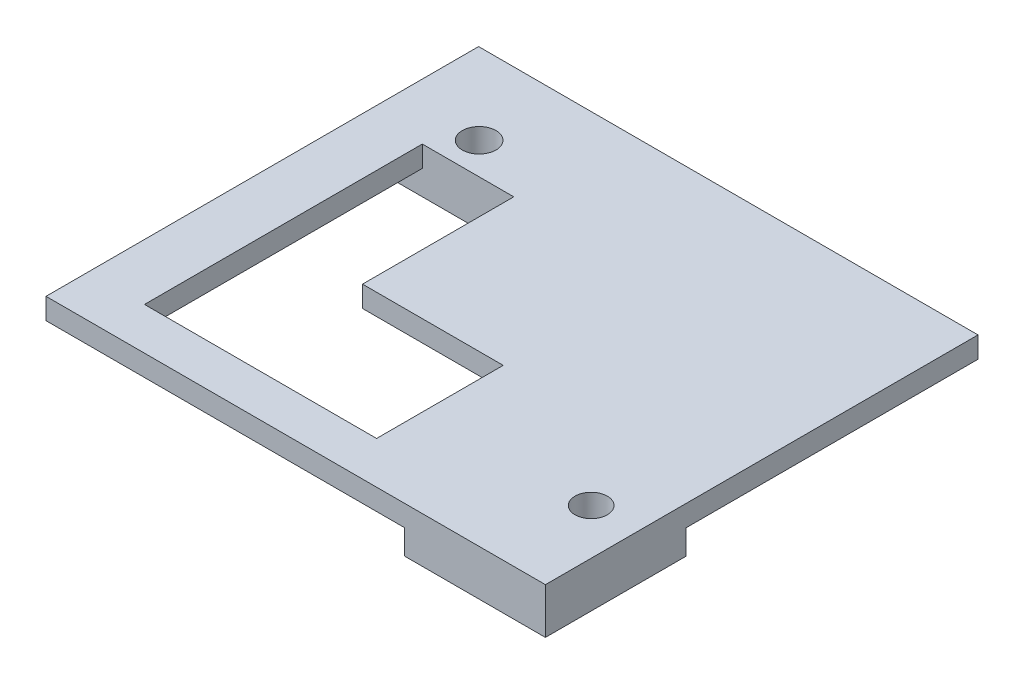
ISO-10303-21;
HEADER;
FILE_DESCRIPTION(('STEP AP214'),'2;1');
FILE_NAME('part.step','',(''),(''),'','','');
FILE_SCHEMA(('AUTOMOTIVE_DESIGN { 1 0 10303 214 1 1 1 1 }'));
ENDSEC;
DATA;
#1=APPLICATION_CONTEXT('core data for automotive mechanical design processes');
#2=APPLICATION_PROTOCOL_DEFINITION('international standard','automotive_design',2000,#1);
#3=PRODUCT_CONTEXT('',#1,'mechanical');
#4=PRODUCT('Part','Part','',(#3));
#5=PRODUCT_RELATED_PRODUCT_CATEGORY('part','',(#4));
#6=PRODUCT_DEFINITION_FORMATION('','',#4);
#7=PRODUCT_DEFINITION_CONTEXT('part definition',#1,'design');
#8=PRODUCT_DEFINITION('design','',#6,#7);
#9=PRODUCT_DEFINITION_SHAPE('','',#8);
#10=(LENGTH_UNIT() NAMED_UNIT(*) SI_UNIT(.MILLI.,.METRE.));
#11=(NAMED_UNIT(*) PLANE_ANGLE_UNIT() SI_UNIT($,.RADIAN.));
#12=(NAMED_UNIT(*) SI_UNIT($,.STERADIAN.) SOLID_ANGLE_UNIT());
#13=UNCERTAINTY_MEASURE_WITH_UNIT(LENGTH_MEASURE(1.E-05),#10,'distance_accuracy_value','');
#14=(GEOMETRIC_REPRESENTATION_CONTEXT(3) GLOBAL_UNCERTAINTY_ASSIGNED_CONTEXT((#13)) GLOBAL_UNIT_ASSIGNED_CONTEXT((#10,
#11,#12)) REPRESENTATION_CONTEXT('',''));
#15=CARTESIAN_POINT('',(0.,0.,0.));
#16=DIRECTION('',(0.,0.,1.));
#17=DIRECTION('',(1.,0.,0.));
#18=AXIS2_PLACEMENT_3D('',#15,#16,#17);
#19=CARTESIAN_POINT('',(0.,1.5,0.));
#20=DIRECTION('',(0.,0.,-1.));
#21=DIRECTION('',(-1.,0.,0.));
#22=AXIS2_PLACEMENT_3D('',#19,#20,#21);
#23=PLANE('',#22);
#24=DIRECTION('',(1.,0.,0.));
#25=VECTOR('',#24,1.);
#26=CARTESIAN_POINT('',(0.,0.,0.));
#27=LINE('',#26,#25);
#28=CARTESIAN_POINT('',(10.,0.,0.));
#29=VERTEX_POINT('',#28);
#30=CARTESIAN_POINT('',(35.5,0.,0.));
#31=VERTEX_POINT('',#30);
#32=EDGE_CURVE('E232',#29,#31,#27,.T.);
#33=ORIENTED_EDGE('',*,*,#32,.T.);
#34=DIRECTION('',(0.,1.,0.));
#35=VECTOR('',#34,1.);
#36=CARTESIAN_POINT('',(35.5,-1.75,0.));
#37=LINE('',#36,#35);
#38=CARTESIAN_POINT('',(35.5,-1.75,0.));
#39=VERTEX_POINT('',#38);
#40=EDGE_CURVE('E187',#39,#31,#37,.T.);
#41=ORIENTED_EDGE('',*,*,#40,.F.);
#42=DIRECTION('',(1.,0.,0.));
#43=VECTOR('',#42,1.);
#44=CARTESIAN_POINT('',(45.5,-1.75,0.));
#45=LINE('',#44,#43);
#46=CARTESIAN_POINT('',(45.5,-1.75,0.));
#47=VERTEX_POINT('',#46);
#48=EDGE_CURVE('E159',#39,#47,#45,.T.);
#49=ORIENTED_EDGE('',*,*,#48,.T.);
#50=DIRECTION('',(0.,-1.,0.));
#51=VECTOR('',#50,1.);
#52=CARTESIAN_POINT('',(45.5,1.5,0.));
#53=LINE('',#52,#51);
#54=CARTESIAN_POINT('',(45.5,1.5,0.));
#55=VERTEX_POINT('',#54);
#56=EDGE_CURVE('E175',#55,#47,#53,.T.);
#57=ORIENTED_EDGE('',*,*,#56,.F.);
#58=DIRECTION('',(1.,0.,0.));
#59=VECTOR('',#58,1.);
#60=CARTESIAN_POINT('',(0.,1.5,0.));
#61=LINE('',#60,#59);
#62=CARTESIAN_POINT('',(10.,1.5,0.));
#63=VERTEX_POINT('',#62);
#64=EDGE_CURVE('E280',#63,#55,#61,.T.);
#65=ORIENTED_EDGE('',*,*,#64,.F.);
#66=DIRECTION('',(0.,1.,0.));
#67=VECTOR('',#66,1.);
#68=CARTESIAN_POINT('',(10.,0.,0.));
#69=LINE('',#68,#67);
#70=EDGE_CURVE('E230',#29,#63,#69,.T.);
#71=ORIENTED_EDGE('',*,*,#70,.F.);
#72=EDGE_LOOP('',(#33,#41,#49,#57,#65,#71));
#73=FACE_BOUND('',#72,.T.);
#74=ADVANCED_FACE('F36',(#73),#23,.F.);
#75=CARTESIAN_POINT('',(0.,1.5,-30.75));
#76=DIRECTION('',(0.,0.,1.));
#77=DIRECTION('',(1.,0.,0.));
#78=AXIS2_PLACEMENT_3D('',#75,#76,#77);
#79=PLANE('',#78);
#80=DIRECTION('',(-1.,0.,0.));
#81=VECTOR('',#80,1.);
#82=CARTESIAN_POINT('',(0.,0.,-30.75));
#83=LINE('',#82,#81);
#84=CARTESIAN_POINT('',(45.5,0.,-30.75));
#85=VERTEX_POINT('',#84);
#86=CARTESIAN_POINT('',(20.,0.,-30.75));
#87=VERTEX_POINT('',#86);
#88=EDGE_CURVE('E283',#85,#87,#83,.T.);
#89=ORIENTED_EDGE('',*,*,#88,.T.);
#90=DIRECTION('',(0.,1.,0.));
#91=VECTOR('',#90,1.);
#92=CARTESIAN_POINT('',(20.,-1.75,-30.75));
#93=LINE('',#92,#91);
#94=CARTESIAN_POINT('',(20.,-1.75,-30.75));
#95=VERTEX_POINT('',#94);
#96=EDGE_CURVE('E209',#95,#87,#93,.T.);
#97=ORIENTED_EDGE('',*,*,#96,.F.);
#98=DIRECTION('',(-1.,0.,0.));
#99=VECTOR('',#98,1.);
#100=CARTESIAN_POINT('',(12.,-1.75,-30.75));
#101=LINE('',#100,#99);
#102=CARTESIAN_POINT('',(12.,-1.75,-30.75));
#103=VERTEX_POINT('',#102);
#104=EDGE_CURVE('E201',#95,#103,#101,.T.);
#105=ORIENTED_EDGE('',*,*,#104,.T.);
#106=DIRECTION('',(0.,1.,0.));
#107=VECTOR('',#106,1.);
#108=CARTESIAN_POINT('',(12.,-1.75,-30.75));
#109=LINE('',#108,#107);
#110=CARTESIAN_POINT('',(12.,0.,-30.75));
#111=VERTEX_POINT('',#110);
#112=EDGE_CURVE('E205',#103,#111,#109,.T.);
#113=ORIENTED_EDGE('',*,*,#112,.T.);
#114=CARTESIAN_POINT('',(10.,0.,-30.75));
#115=VERTEX_POINT('',#114);
#116=EDGE_CURVE('E291',#111,#115,#83,.T.);
#117=ORIENTED_EDGE('',*,*,#116,.T.);
#118=DIRECTION('',(0.,1.,0.));
#119=VECTOR('',#118,1.);
#120=CARTESIAN_POINT('',(10.,0.,-30.75));
#121=LINE('',#120,#119);
#122=CARTESIAN_POINT('',(10.,1.5,-30.75));
#123=VERTEX_POINT('',#122);
#124=EDGE_CURVE('E225',#115,#123,#121,.T.);
#125=ORIENTED_EDGE('',*,*,#124,.T.);
#126=DIRECTION('',(-1.,0.,0.));
#127=VECTOR('',#126,1.);
#128=CARTESIAN_POINT('',(0.,1.5,-30.75));
#129=LINE('',#128,#127);
#130=CARTESIAN_POINT('',(45.5,1.5,-30.75));
#131=VERTEX_POINT('',#130);
#132=EDGE_CURVE('E285',#131,#123,#129,.T.);
#133=ORIENTED_EDGE('',*,*,#132,.F.);
#134=DIRECTION('',(0.,-1.,0.));
#135=VECTOR('',#134,1.);
#136=CARTESIAN_POINT('',(45.5,1.5,-30.75));
#137=LINE('',#136,#135);
#138=EDGE_CURVE('E287',#131,#85,#137,.T.);
#139=ORIENTED_EDGE('',*,*,#138,.T.);
#140=EDGE_LOOP('',(#89,#97,#105,#113,#117,#125,#133,#139));
#141=FACE_BOUND('',#140,.T.);
#142=ADVANCED_FACE('F301',(#141),#79,.F.);
#143=CARTESIAN_POINT('',(0.,1.5,0.));
#144=DIRECTION('',(0.,-1.,0.));
#145=DIRECTION('',(0.,0.,-1.));
#146=AXIS2_PLACEMENT_3D('',#143,#144,#145);
#147=PLANE('',#146);
#148=CARTESIAN_POINT('',(42.25,1.5,-6.5));
#149=DIRECTION('',(0.,-1.,0.));
#150=DIRECTION('',(0.,0.,-1.));
#151=AXIS2_PLACEMENT_3D('',#148,#149,#150);
#152=CIRCLE('',#151,1.15);
#153=CARTESIAN_POINT('',(42.25,1.5,-7.65));
#154=VERTEX_POINT('',#153);
#155=EDGE_CURVE('E176',#154,#154,#152,.T.);
#156=ORIENTED_EDGE('',*,*,#155,.T.);
#157=EDGE_LOOP('',(#156));
#158=FACE_BOUND('',#157,.T.);
#159=CARTESIAN_POINT('',(15.79,1.5,-25.));
#160=DIRECTION('',(0.,-1.,0.));
#161=DIRECTION('',(0.,0.,-1.));
#162=AXIS2_PLACEMENT_3D('',#159,#160,#161);
#163=CIRCLE('',#162,1.2);
#164=CARTESIAN_POINT('',(15.79,1.5,-26.2));
#165=VERTEX_POINT('',#164);
#166=EDGE_CURVE('E529',#165,#165,#163,.T.);
#167=ORIENTED_EDGE('',*,*,#166,.T.);
#168=EDGE_LOOP('',(#167));
#169=FACE_BOUND('',#168,.T.);
#170=ORIENTED_EDGE('',*,*,#64,.T.);
#171=DIRECTION('',(0.,0.,-1.));
#172=VECTOR('',#171,1.);
#173=CARTESIAN_POINT('',(45.5,1.5,0.));
#174=LINE('',#173,#172);
#175=EDGE_CURVE('E282',#55,#131,#174,.T.);
#176=ORIENTED_EDGE('',*,*,#175,.T.);
#177=ORIENTED_EDGE('',*,*,#132,.T.);
#178=DIRECTION('',(0.,0.,1.));
#179=VECTOR('',#178,1.);
#180=CARTESIAN_POINT('',(10.,1.5,0.));
#181=LINE('',#180,#179);
#182=EDGE_CURVE('E226',#123,#63,#181,.T.);
#183=ORIENTED_EDGE('',*,*,#182,.T.);
#184=EDGE_LOOP('',(#170,#176,#177,#183));
#185=FACE_BOUND('',#184,.T.);
#186=DIRECTION('',(0.,0.,1.));
#187=VECTOR('',#186,1.);
#188=CARTESIAN_POINT('',(14.,1.5,0.));
#189=LINE('',#188,#187);
#190=CARTESIAN_POINT('',(14.,1.5,-22.75));
#191=VERTEX_POINT('',#190);
#192=CARTESIAN_POINT('',(14.,1.5,-3.));
#193=VERTEX_POINT('',#192);
#194=EDGE_CURVE('E222',#191,#193,#189,.T.);
#195=ORIENTED_EDGE('',*,*,#194,.F.);
#196=DIRECTION('',(-1.,0.,0.));
#197=VECTOR('',#196,1.);
#198=CARTESIAN_POINT('',(0.,1.5,-22.75));
#199=LINE('',#198,#197);
#200=CARTESIAN_POINT('',(20.5,1.5,-22.75));
#201=VERTEX_POINT('',#200);
#202=EDGE_CURVE('E239',#201,#191,#199,.T.);
#203=ORIENTED_EDGE('',*,*,#202,.F.);
#204=DIRECTION('',(0.,0.,-1.));
#205=VECTOR('',#204,1.);
#206=CARTESIAN_POINT('',(20.5,1.5,0.));
#207=LINE('',#206,#205);
#208=CARTESIAN_POINT('',(20.5,1.5,-12.));
#209=VERTEX_POINT('',#208);
#210=EDGE_CURVE('E264',#209,#201,#207,.T.);
#211=ORIENTED_EDGE('',*,*,#210,.F.);
#212=DIRECTION('',(-1.,0.,0.));
#213=VECTOR('',#212,1.);
#214=CARTESIAN_POINT('',(0.,1.5,-12.));
#215=LINE('',#214,#213);
#216=CARTESIAN_POINT('',(30.5,1.5,-12.));
#217=VERTEX_POINT('',#216);
#218=EDGE_CURVE('E261',#217,#209,#215,.T.);
#219=ORIENTED_EDGE('',*,*,#218,.F.);
#220=DIRECTION('',(0.,0.,-1.));
#221=VECTOR('',#220,1.);
#222=CARTESIAN_POINT('',(30.5,1.5,0.));
#223=LINE('',#222,#221);
#224=CARTESIAN_POINT('',(30.5,1.5,-3.));
#225=VERTEX_POINT('',#224);
#226=EDGE_CURVE('E258',#225,#217,#223,.T.);
#227=ORIENTED_EDGE('',*,*,#226,.F.);
#228=DIRECTION('',(1.,0.,0.));
#229=VECTOR('',#228,1.);
#230=CARTESIAN_POINT('',(0.,1.5,-3.));
#231=LINE('',#230,#229);
#232=EDGE_CURVE('E255',#193,#225,#231,.T.);
#233=ORIENTED_EDGE('',*,*,#232,.F.);
#234=EDGE_LOOP('',(#195,#203,#211,#219,#227,#233));
#235=FACE_BOUND('',#234,.T.);
#236=ADVANCED_FACE('F353',(#158,#169,#185,#235),#147,.F.);
#237=CARTESIAN_POINT('',(0.,0.,0.));
#238=DIRECTION('',(0.,-1.,0.));
#239=DIRECTION('',(0.,0.,-1.));
#240=AXIS2_PLACEMENT_3D('',#237,#238,#239);
#241=PLANE('',#240);
#242=DIRECTION('',(0.,0.,-1.));
#243=VECTOR('',#242,1.);
#244=CARTESIAN_POINT('',(35.5,0.,0.));
#245=LINE('',#244,#243);
#246=CARTESIAN_POINT('',(35.5,0.,-10.));
#247=VERTEX_POINT('',#246);
#248=EDGE_CURVE('E11',#31,#247,#245,.T.);
#249=ORIENTED_EDGE('',*,*,#248,.F.);
#250=ORIENTED_EDGE('',*,*,#32,.F.);
#251=DIRECTION('',(0.,0.,1.));
#252=VECTOR('',#251,1.);
#253=CARTESIAN_POINT('',(10.,0.,0.));
#254=LINE('',#253,#252);
#255=EDGE_CURVE('E223',#115,#29,#254,.T.);
#256=ORIENTED_EDGE('',*,*,#255,.F.);
#257=ORIENTED_EDGE('',*,*,#116,.F.);
#258=DIRECTION('',(0.,0.,-1.));
#259=VECTOR('',#258,1.);
#260=CARTESIAN_POINT('',(12.,0.,0.));
#261=LINE('',#260,#259);
#262=CARTESIAN_POINT('',(12.,0.,-22.75));
#263=VERTEX_POINT('',#262);
#264=EDGE_CURVE('E43',#263,#111,#261,.T.);
#265=ORIENTED_EDGE('',*,*,#264,.F.);
#266=DIRECTION('',(-1.,0.,0.));
#267=VECTOR('',#266,1.);
#268=CARTESIAN_POINT('',(0.,0.,-22.75));
#269=LINE('',#268,#267);
#270=CARTESIAN_POINT('',(14.,0.,-22.75));
#271=VERTEX_POINT('',#270);
#272=EDGE_CURVE('E219',#271,#263,#269,.T.);
#273=ORIENTED_EDGE('',*,*,#272,.F.);
#274=DIRECTION('',(0.,0.,1.));
#275=VECTOR('',#274,1.);
#276=CARTESIAN_POINT('',(14.,0.,0.));
#277=LINE('',#276,#275);
#278=CARTESIAN_POINT('',(14.,0.,-3.));
#279=VERTEX_POINT('',#278);
#280=EDGE_CURVE('E235',#271,#279,#277,.T.);
#281=ORIENTED_EDGE('',*,*,#280,.T.);
#282=DIRECTION('',(1.,0.,0.));
#283=VECTOR('',#282,1.);
#284=CARTESIAN_POINT('',(0.,0.,-3.));
#285=LINE('',#284,#283);
#286=CARTESIAN_POINT('',(30.5,0.,-3.));
#287=VERTEX_POINT('',#286);
#288=EDGE_CURVE('E238',#279,#287,#285,.T.);
#289=ORIENTED_EDGE('',*,*,#288,.T.);
#290=DIRECTION('',(0.,0.,-1.));
#291=VECTOR('',#290,1.);
#292=CARTESIAN_POINT('',(30.5,0.,0.));
#293=LINE('',#292,#291);
#294=CARTESIAN_POINT('',(30.5,0.,-12.));
#295=VERTEX_POINT('',#294);
#296=EDGE_CURVE('E242',#287,#295,#293,.T.);
#297=ORIENTED_EDGE('',*,*,#296,.T.);
#298=DIRECTION('',(-1.,0.,0.));
#299=VECTOR('',#298,1.);
#300=CARTESIAN_POINT('',(0.,0.,-12.));
#301=LINE('',#300,#299);
#302=CARTESIAN_POINT('',(20.5,0.,-12.));
#303=VERTEX_POINT('',#302);
#304=EDGE_CURVE('E245',#295,#303,#301,.T.);
#305=ORIENTED_EDGE('',*,*,#304,.T.);
#306=DIRECTION('',(0.,0.,-1.));
#307=VECTOR('',#306,1.);
#308=CARTESIAN_POINT('',(20.5,0.,0.));
#309=LINE('',#308,#307);
#310=CARTESIAN_POINT('',(20.5,0.,-22.75));
#311=VERTEX_POINT('',#310);
#312=EDGE_CURVE('E248',#303,#311,#309,.T.);
#313=ORIENTED_EDGE('',*,*,#312,.T.);
#314=DIRECTION('',(-1.,0.,0.));
#315=VECTOR('',#314,1.);
#316=CARTESIAN_POINT('',(0.,0.,-22.75));
#317=LINE('',#316,#315);
#318=CARTESIAN_POINT('',(20.,0.,-22.75));
#319=VERTEX_POINT('',#318);
#320=EDGE_CURVE('E251',#311,#319,#317,.T.);
#321=ORIENTED_EDGE('',*,*,#320,.T.);
#322=DIRECTION('',(0.,0.,1.));
#323=VECTOR('',#322,1.);
#324=CARTESIAN_POINT('',(20.,0.,0.));
#325=LINE('',#324,#323);
#326=EDGE_CURVE('E208',#87,#319,#325,.T.);
#327=ORIENTED_EDGE('',*,*,#326,.F.);
#328=ORIENTED_EDGE('',*,*,#88,.F.);
#329=DIRECTION('',(0.,0.,-1.));
#330=VECTOR('',#329,1.);
#331=CARTESIAN_POINT('',(45.5,0.,0.));
#332=LINE('',#331,#330);
#333=CARTESIAN_POINT('',(45.5,0.,-10.));
#334=VERTEX_POINT('',#333);
#335=EDGE_CURVE('E289',#334,#85,#332,.T.);
#336=ORIENTED_EDGE('',*,*,#335,.F.);
#337=DIRECTION('',(1.,0.,0.));
#338=VECTOR('',#337,1.);
#339=CARTESIAN_POINT('',(0.,0.,-9.99999999999999));
#340=LINE('',#339,#338);
#341=EDGE_CURVE('E50',#247,#334,#340,.T.);
#342=ORIENTED_EDGE('',*,*,#341,.F.);
#343=EDGE_LOOP('',(#249,#250,#256,#257,#265,#273,#281,#289,#297,#305,#313,#321,#327,#328,#336,#342));
#344=FACE_BOUND('',#343,.T.);
#345=ADVANCED_FACE('F313',(#344),#241,.T.);
#346=CARTESIAN_POINT('',(45.5,1.5,0.));
#347=DIRECTION('',(-1.,0.,0.));
#348=DIRECTION('',(0.,0.,1.));
#349=AXIS2_PLACEMENT_3D('',#346,#347,#348);
#350=PLANE('',#349);
#351=ORIENTED_EDGE('',*,*,#138,.F.);
#352=ORIENTED_EDGE('',*,*,#175,.F.);
#353=ORIENTED_EDGE('',*,*,#56,.T.);
#354=DIRECTION('',(0.,0.,-1.));
#355=VECTOR('',#354,1.);
#356=CARTESIAN_POINT('',(45.5,-1.75,0.));
#357=LINE('',#356,#355);
#358=CARTESIAN_POINT('',(45.5,-1.75,-10.));
#359=VERTEX_POINT('',#358);
#360=EDGE_CURVE('E166',#47,#359,#357,.T.);
#361=ORIENTED_EDGE('',*,*,#360,.T.);
#362=DIRECTION('',(0.,1.,0.));
#363=VECTOR('',#362,1.);
#364=CARTESIAN_POINT('',(45.5,-1.75,-10.));
#365=LINE('',#364,#363);
#366=EDGE_CURVE('E151',#359,#334,#365,.T.);
#367=ORIENTED_EDGE('',*,*,#366,.T.);
#368=ORIENTED_EDGE('',*,*,#335,.T.);
#369=EDGE_LOOP('',(#351,#352,#353,#361,#367,#368));
#370=FACE_BOUND('',#369,.T.);
#371=ADVANCED_FACE('F172',(#370),#350,.F.);
#372=CARTESIAN_POINT('',(14.,0.,0.));
#373=DIRECTION('',(-1.,0.,0.));
#374=DIRECTION('',(0.,0.,1.));
#375=AXIS2_PLACEMENT_3D('',#372,#373,#374);
#376=PLANE('',#375);
#377=ORIENTED_EDGE('',*,*,#194,.T.);
#378=DIRECTION('',(0.,1.,0.));
#379=VECTOR('',#378,1.);
#380=CARTESIAN_POINT('',(14.,0.,-3.));
#381=LINE('',#380,#379);
#382=EDGE_CURVE('E253',#279,#193,#381,.T.);
#383=ORIENTED_EDGE('',*,*,#382,.F.);
#384=ORIENTED_EDGE('',*,*,#280,.F.);
#385=DIRECTION('',(0.,1.,0.));
#386=VECTOR('',#385,1.);
#387=CARTESIAN_POINT('',(14.,0.,-22.75));
#388=LINE('',#387,#386);
#389=EDGE_CURVE('E229',#271,#191,#388,.T.);
#390=ORIENTED_EDGE('',*,*,#389,.T.);
#391=EDGE_LOOP('',(#377,#383,#384,#390));
#392=FACE_BOUND('',#391,.T.);
#393=ADVANCED_FACE('F316',(#392),#376,.F.);
#394=CARTESIAN_POINT('',(0.,0.,-22.75));
#395=DIRECTION('',(0.,0.,-1.));
#396=DIRECTION('',(-1.,0.,0.));
#397=AXIS2_PLACEMENT_3D('',#394,#395,#396);
#398=PLANE('',#397);
#399=ORIENTED_EDGE('',*,*,#202,.T.);
#400=ORIENTED_EDGE('',*,*,#389,.F.);
#401=ORIENTED_EDGE('',*,*,#272,.T.);
#402=DIRECTION('',(0.,1.,0.));
#403=VECTOR('',#402,1.);
#404=CARTESIAN_POINT('',(12.,-1.75,-22.75));
#405=LINE('',#404,#403);
#406=CARTESIAN_POINT('',(12.,-1.75,-22.75));
#407=VERTEX_POINT('',#406);
#408=EDGE_CURVE('E204',#407,#263,#405,.T.);
#409=ORIENTED_EDGE('',*,*,#408,.F.);
#410=DIRECTION('',(1.,0.,0.));
#411=VECTOR('',#410,1.);
#412=CARTESIAN_POINT('',(12.,-1.75,-22.75));
#413=LINE('',#412,#411);
#414=CARTESIAN_POINT('',(20.,-1.75,-22.75));
#415=VERTEX_POINT('',#414);
#416=EDGE_CURVE('E195',#407,#415,#413,.T.);
#417=ORIENTED_EDGE('',*,*,#416,.T.);
#418=DIRECTION('',(0.,1.,0.));
#419=VECTOR('',#418,1.);
#420=CARTESIAN_POINT('',(20.,-1.75,-22.75));
#421=LINE('',#420,#419);
#422=EDGE_CURVE('E212',#415,#319,#421,.T.);
#423=ORIENTED_EDGE('',*,*,#422,.T.);
#424=ORIENTED_EDGE('',*,*,#320,.F.);
#425=DIRECTION('',(0.,1.,0.));
#426=VECTOR('',#425,1.);
#427=CARTESIAN_POINT('',(20.5,0.,-22.75));
#428=LINE('',#427,#426);
#429=EDGE_CURVE('E270',#311,#201,#428,.T.);
#430=ORIENTED_EDGE('',*,*,#429,.T.);
#431=EDGE_LOOP('',(#399,#400,#401,#409,#417,#423,#424,#430));
#432=FACE_BOUND('',#431,.T.);
#433=ADVANCED_FACE('F309',(#432),#398,.F.);
#434=CARTESIAN_POINT('',(20.5,0.,0.));
#435=DIRECTION('',(1.,0.,0.));
#436=DIRECTION('',(0.,0.,-1.));
#437=AXIS2_PLACEMENT_3D('',#434,#435,#436);
#438=PLANE('',#437);
#439=ORIENTED_EDGE('',*,*,#210,.T.);
#440=ORIENTED_EDGE('',*,*,#429,.F.);
#441=ORIENTED_EDGE('',*,*,#312,.F.);
#442=DIRECTION('',(0.,1.,0.));
#443=VECTOR('',#442,1.);
#444=CARTESIAN_POINT('',(20.5,0.,-12.));
#445=LINE('',#444,#443);
#446=EDGE_CURVE('E272',#303,#209,#445,.T.);
#447=ORIENTED_EDGE('',*,*,#446,.T.);
#448=EDGE_LOOP('',(#439,#440,#441,#447));
#449=FACE_BOUND('',#448,.T.);
#450=ADVANCED_FACE('F332',(#449),#438,.F.);
#451=CARTESIAN_POINT('',(0.,0.,-12.));
#452=DIRECTION('',(0.,0.,-1.));
#453=DIRECTION('',(-1.,0.,0.));
#454=AXIS2_PLACEMENT_3D('',#451,#452,#453);
#455=PLANE('',#454);
#456=ORIENTED_EDGE('',*,*,#218,.T.);
#457=ORIENTED_EDGE('',*,*,#446,.F.);
#458=ORIENTED_EDGE('',*,*,#304,.F.);
#459=DIRECTION('',(0.,1.,0.));
#460=VECTOR('',#459,1.);
#461=CARTESIAN_POINT('',(30.5,0.,-12.));
#462=LINE('',#461,#460);
#463=EDGE_CURVE('E274',#295,#217,#462,.T.);
#464=ORIENTED_EDGE('',*,*,#463,.T.);
#465=EDGE_LOOP('',(#456,#457,#458,#464));
#466=FACE_BOUND('',#465,.T.);
#467=ADVANCED_FACE('F329',(#466),#455,.F.);
#468=CARTESIAN_POINT('',(30.5,0.,0.));
#469=DIRECTION('',(1.,0.,0.));
#470=DIRECTION('',(0.,0.,-1.));
#471=AXIS2_PLACEMENT_3D('',#468,#469,#470);
#472=PLANE('',#471);
#473=ORIENTED_EDGE('',*,*,#226,.T.);
#474=ORIENTED_EDGE('',*,*,#463,.F.);
#475=ORIENTED_EDGE('',*,*,#296,.F.);
#476=DIRECTION('',(0.,1.,0.));
#477=VECTOR('',#476,1.);
#478=CARTESIAN_POINT('',(30.5,0.,-3.));
#479=LINE('',#478,#477);
#480=EDGE_CURVE('E276',#287,#225,#479,.T.);
#481=ORIENTED_EDGE('',*,*,#480,.T.);
#482=EDGE_LOOP('',(#473,#474,#475,#481));
#483=FACE_BOUND('',#482,.T.);
#484=ADVANCED_FACE('F324',(#483),#472,.F.);
#485=CARTESIAN_POINT('',(0.,0.,-3.));
#486=DIRECTION('',(0.,0.,1.));
#487=DIRECTION('',(1.,0.,0.));
#488=AXIS2_PLACEMENT_3D('',#485,#486,#487);
#489=PLANE('',#488);
#490=ORIENTED_EDGE('',*,*,#232,.T.);
#491=ORIENTED_EDGE('',*,*,#480,.F.);
#492=ORIENTED_EDGE('',*,*,#288,.F.);
#493=ORIENTED_EDGE('',*,*,#382,.T.);
#494=EDGE_LOOP('',(#490,#491,#492,#493));
#495=FACE_BOUND('',#494,.T.);
#496=ADVANCED_FACE('F321',(#495),#489,.F.);
#497=CARTESIAN_POINT('',(10.,0.,0.));
#498=DIRECTION('',(-1.,0.,0.));
#499=DIRECTION('',(0.,0.,1.));
#500=AXIS2_PLACEMENT_3D('',#497,#498,#499);
#501=PLANE('',#500);
#502=ORIENTED_EDGE('',*,*,#182,.F.);
#503=ORIENTED_EDGE('',*,*,#124,.F.);
#504=ORIENTED_EDGE('',*,*,#255,.T.);
#505=ORIENTED_EDGE('',*,*,#70,.T.);
#506=EDGE_LOOP('',(#502,#503,#504,#505));
#507=FACE_BOUND('',#506,.T.);
#508=ADVANCED_FACE('F346',(#507),#501,.T.);
#509=CARTESIAN_POINT('',(12.,-1.75,-22.75));
#510=DIRECTION('',(-1.,0.,0.));
#511=DIRECTION('',(0.,0.,1.));
#512=AXIS2_PLACEMENT_3D('',#509,#510,#511);
#513=PLANE('',#512);
#514=ORIENTED_EDGE('',*,*,#408,.T.);
#515=ORIENTED_EDGE('',*,*,#264,.T.);
#516=ORIENTED_EDGE('',*,*,#112,.F.);
#517=DIRECTION('',(0.,0.,1.));
#518=VECTOR('',#517,1.);
#519=CARTESIAN_POINT('',(12.,-1.75,-22.75));
#520=LINE('',#519,#518);
#521=EDGE_CURVE('E192',#103,#407,#520,.T.);
#522=ORIENTED_EDGE('',*,*,#521,.T.);
#523=EDGE_LOOP('',(#514,#515,#516,#522));
#524=FACE_BOUND('',#523,.T.);
#525=ADVANCED_FACE('F298',(#524),#513,.T.);
#526=CARTESIAN_POINT('',(20.,-1.75,-22.75));
#527=DIRECTION('',(1.,0.,0.));
#528=DIRECTION('',(0.,0.,-1.));
#529=AXIS2_PLACEMENT_3D('',#526,#527,#528);
#530=PLANE('',#529);
#531=ORIENTED_EDGE('',*,*,#96,.T.);
#532=ORIENTED_EDGE('',*,*,#326,.T.);
#533=ORIENTED_EDGE('',*,*,#422,.F.);
#534=DIRECTION('',(0.,0.,-1.));
#535=VECTOR('',#534,1.);
#536=CARTESIAN_POINT('',(20.,-1.75,-22.75));
#537=LINE('',#536,#535);
#538=EDGE_CURVE('E198',#415,#95,#537,.T.);
#539=ORIENTED_EDGE('',*,*,#538,.T.);
#540=EDGE_LOOP('',(#531,#532,#533,#539));
#541=FACE_BOUND('',#540,.T.);
#542=ADVANCED_FACE('F336',(#541),#530,.T.);
#543=CARTESIAN_POINT('',(0.,-1.75,0.));
#544=DIRECTION('',(0.,-1.,0.));
#545=DIRECTION('',(0.,0.,-1.));
#546=AXIS2_PLACEMENT_3D('',#543,#544,#545);
#547=PLANE('',#546);
#548=CARTESIAN_POINT('',(15.79,-1.75,-25.));
#549=DIRECTION('',(0.,-1.,0.));
#550=DIRECTION('',(0.,0.,-1.));
#551=AXIS2_PLACEMENT_3D('',#548,#549,#550);
#552=CIRCLE('',#551,1.2);
#553=CARTESIAN_POINT('',(15.79,-1.75,-26.2));
#554=VERTEX_POINT('',#553);
#555=EDGE_CURVE('E182',#554,#554,#552,.T.);
#556=ORIENTED_EDGE('',*,*,#555,.F.);
#557=EDGE_LOOP('',(#556));
#558=FACE_BOUND('',#557,.T.);
#559=ORIENTED_EDGE('',*,*,#521,.F.);
#560=ORIENTED_EDGE('',*,*,#104,.F.);
#561=ORIENTED_EDGE('',*,*,#538,.F.);
#562=ORIENTED_EDGE('',*,*,#416,.F.);
#563=EDGE_LOOP('',(#559,#560,#561,#562));
#564=FACE_BOUND('',#563,.T.);
#565=ADVANCED_FACE('F306',(#558,#564),#547,.T.);
#566=CARTESIAN_POINT('',(35.5,-1.75,0.));
#567=DIRECTION('',(-1.,0.,0.));
#568=DIRECTION('',(0.,0.,1.));
#569=AXIS2_PLACEMENT_3D('',#566,#567,#568);
#570=PLANE('',#569);
#571=ORIENTED_EDGE('',*,*,#40,.T.);
#572=ORIENTED_EDGE('',*,*,#248,.T.);
#573=DIRECTION('',(0.,1.,0.));
#574=VECTOR('',#573,1.);
#575=CARTESIAN_POINT('',(35.5,-1.75,-10.));
#576=LINE('',#575,#574);
#577=CARTESIAN_POINT('',(35.5,-1.75,-10.));
#578=VERTEX_POINT('',#577);
#579=EDGE_CURVE('E158',#578,#247,#576,.T.);
#580=ORIENTED_EDGE('',*,*,#579,.F.);
#581=DIRECTION('',(0.,0.,1.));
#582=VECTOR('',#581,1.);
#583=CARTESIAN_POINT('',(35.5,-1.75,0.));
#584=LINE('',#583,#582);
#585=EDGE_CURVE('E169',#578,#39,#584,.T.);
#586=ORIENTED_EDGE('',*,*,#585,.T.);
#587=EDGE_LOOP('',(#571,#572,#580,#586));
#588=FACE_BOUND('',#587,.T.);
#589=ADVANCED_FACE('F343',(#588),#570,.T.);
#590=CARTESIAN_POINT('',(45.5,-1.75,-10.));
#591=DIRECTION('',(0.,0.,-1.));
#592=DIRECTION('',(-1.,0.,0.));
#593=AXIS2_PLACEMENT_3D('',#590,#591,#592);
#594=PLANE('',#593);
#595=ORIENTED_EDGE('',*,*,#579,.T.);
#596=ORIENTED_EDGE('',*,*,#341,.T.);
#597=ORIENTED_EDGE('',*,*,#366,.F.);
#598=DIRECTION('',(-1.,0.,0.));
#599=VECTOR('',#598,1.);
#600=CARTESIAN_POINT('',(45.5,-1.75,-10.));
#601=LINE('',#600,#599);
#602=EDGE_CURVE('E155',#359,#578,#601,.T.);
#603=ORIENTED_EDGE('',*,*,#602,.T.);
#604=EDGE_LOOP('',(#595,#596,#597,#603));
#605=FACE_BOUND('',#604,.T.);
#606=ADVANCED_FACE('F154',(#605),#594,.T.);
#607=CARTESIAN_POINT('',(0.,-1.75,0.));
#608=DIRECTION('',(0.,1.,0.));
#609=DIRECTION('',(0.,0.,1.));
#610=AXIS2_PLACEMENT_3D('',#607,#608,#609);
#611=PLANE('',#610);
#612=CARTESIAN_POINT('',(42.25,-1.75,-6.5));
#613=DIRECTION('',(0.,-1.,0.));
#614=DIRECTION('',(0.,0.,-1.));
#615=AXIS2_PLACEMENT_3D('',#612,#613,#614);
#616=CIRCLE('',#615,1.15);
#617=CARTESIAN_POINT('',(42.25,-1.75,-7.65));
#618=VERTEX_POINT('',#617);
#619=EDGE_CURVE('E179',#618,#618,#616,.T.);
#620=ORIENTED_EDGE('',*,*,#619,.F.);
#621=EDGE_LOOP('',(#620));
#622=FACE_BOUND('',#621,.T.);
#623=ORIENTED_EDGE('',*,*,#360,.F.);
#624=ORIENTED_EDGE('',*,*,#48,.F.);
#625=ORIENTED_EDGE('',*,*,#585,.F.);
#626=ORIENTED_EDGE('',*,*,#602,.F.);
#627=EDGE_LOOP('',(#623,#624,#625,#626));
#628=FACE_BOUND('',#627,.T.);
#629=ADVANCED_FACE('F164',(#622,#628),#611,.F.);
#630=CARTESIAN_POINT('',(42.25,1.5,-6.5));
#631=DIRECTION('',(0.,-1.,0.));
#632=DIRECTION('',(0.,0.,-1.));
#633=AXIS2_PLACEMENT_3D('',#630,#631,#632);
#634=CYLINDRICAL_SURFACE('',#633,1.15);
#635=CARTESIAN_POINT('',(42.25,1.5,-7.65));
#636=CARTESIAN_POINT('',(42.25,1.46614583333333,-7.65));
#637=CARTESIAN_POINT('',(42.25,1.43229166666667,-7.65));
#638=CARTESIAN_POINT('',(42.25,1.36458333333333,-7.65));
#639=CARTESIAN_POINT('',(42.25,1.33072916666667,-7.65));
#640=CARTESIAN_POINT('',(42.25,1.26302083333333,-7.65));
#641=CARTESIAN_POINT('',(42.25,1.22916666666667,-7.65));
#642=CARTESIAN_POINT('',(42.25,1.16145833333333,-7.65));
#643=CARTESIAN_POINT('',(42.25,1.12760416666667,-7.65));
#644=CARTESIAN_POINT('',(42.25,1.05989583333333,-7.65));
#645=CARTESIAN_POINT('',(42.25,1.02604166666667,-7.65));
#646=CARTESIAN_POINT('',(42.25,0.958333333333333,-7.65));
#647=CARTESIAN_POINT('',(42.25,0.924479166666667,-7.65));
#648=CARTESIAN_POINT('',(42.25,0.856770833333333,-7.65));
#649=CARTESIAN_POINT('',(42.25,0.822916666666667,-7.65));
#650=CARTESIAN_POINT('',(42.25,0.755208333333333,-7.65));
#651=CARTESIAN_POINT('',(42.25,0.721354166666667,-7.65));
#652=CARTESIAN_POINT('',(42.25,0.653645833333334,-7.65));
#653=CARTESIAN_POINT('',(42.25,0.619791666666667,-7.65));
#654=CARTESIAN_POINT('',(42.25,0.552083333333334,-7.65));
#655=CARTESIAN_POINT('',(42.25,0.518229166666667,-7.65));
#656=CARTESIAN_POINT('',(42.25,0.450520833333333,-7.65));
#657=CARTESIAN_POINT('',(42.25,0.416666666666667,-7.65));
#658=CARTESIAN_POINT('',(42.25,0.348958333333333,-7.65));
#659=CARTESIAN_POINT('',(42.25,0.315104166666667,-7.65));
#660=CARTESIAN_POINT('',(42.25,0.247395833333333,-7.65));
#661=CARTESIAN_POINT('',(42.25,0.213541666666667,-7.65));
#662=CARTESIAN_POINT('',(42.25,0.145833333333333,-7.65));
#663=CARTESIAN_POINT('',(42.25,0.111979166666667,-7.65));
#664=CARTESIAN_POINT('',(42.25,0.0442708333333334,-7.65));
#665=CARTESIAN_POINT('',(42.25,0.0104166666666668,-7.65));
#666=CARTESIAN_POINT('',(42.25,-0.0572916666666665,-7.65));
#667=CARTESIAN_POINT('',(42.25,-0.0911458333333332,-7.65));
#668=CARTESIAN_POINT('',(42.25,-0.158854166666667,-7.65));
#669=CARTESIAN_POINT('',(42.25,-0.192708333333333,-7.65));
#670=CARTESIAN_POINT('',(42.25,-0.260416666666667,-7.65));
#671=CARTESIAN_POINT('',(42.25,-0.294270833333333,-7.65));
#672=CARTESIAN_POINT('',(42.25,-0.361979166666667,-7.65));
#673=CARTESIAN_POINT('',(42.25,-0.395833333333333,-7.65));
#674=CARTESIAN_POINT('',(42.25,-0.463541666666667,-7.65));
#675=CARTESIAN_POINT('',(42.25,-0.497395833333333,-7.65));
#676=CARTESIAN_POINT('',(42.25,-0.565104166666666,-7.65));
#677=CARTESIAN_POINT('',(42.25,-0.598958333333333,-7.65));
#678=CARTESIAN_POINT('',(42.25,-0.666666666666666,-7.65));
#679=CARTESIAN_POINT('',(42.25,-0.700520833333333,-7.65));
#680=CARTESIAN_POINT('',(42.25,-0.768229166666667,-7.65));
#681=CARTESIAN_POINT('',(42.25,-0.802083333333333,-7.65));
#682=CARTESIAN_POINT('',(42.25,-0.869791666666667,-7.65));
#683=CARTESIAN_POINT('',(42.25,-0.903645833333333,-7.65));
#684=CARTESIAN_POINT('',(42.25,-0.971354166666667,-7.65));
#685=CARTESIAN_POINT('',(42.25,-1.00520833333333,-7.65));
#686=CARTESIAN_POINT('',(42.25,-1.07291666666667,-7.65));
#687=CARTESIAN_POINT('',(42.25,-1.10677083333333,-7.65));
#688=CARTESIAN_POINT('',(42.25,-1.17447916666667,-7.65));
#689=CARTESIAN_POINT('',(42.25,-1.20833333333333,-7.65));
#690=CARTESIAN_POINT('',(42.25,-1.27604166666667,-7.65));
#691=CARTESIAN_POINT('',(42.25,-1.30989583333333,-7.65));
#692=CARTESIAN_POINT('',(42.25,-1.37760416666667,-7.65));
#693=CARTESIAN_POINT('',(42.25,-1.41145833333333,-7.65));
#694=CARTESIAN_POINT('',(42.25,-1.47916666666667,-7.65));
#695=CARTESIAN_POINT('',(42.25,-1.51302083333333,-7.65));
#696=CARTESIAN_POINT('',(42.25,-1.58072916666667,-7.65));
#697=CARTESIAN_POINT('',(42.25,-1.61458333333333,-7.65));
#698=CARTESIAN_POINT('',(42.25,-1.68229166666667,-7.65));
#699=CARTESIAN_POINT('',(42.25,-1.71614583333333,-7.65));
#700=CARTESIAN_POINT('',(42.25,-1.75,-7.65));
#701=B_SPLINE_CURVE_WITH_KNOTS('',3,(#635,#636,#637,#638,#639,#640,#641,#642,#643,#644,#645,
#646,#647,#648,#649,#650,#651,#652,#653,#654,#655,#656,#657,#658,#659,#660,#661,#662,#663,#664,
#665,#666,#667,#668,#669,#670,#671,#672,#673,#674,#675,#676,#677,#678,#679,#680,#681,#682,#683,
#684,#685,#686,#687,#688,#689,#690,#691,#692,#693,#694,#695,#696,#697,#698,#699,#700),
.UNSPECIFIED.,.F.,.F.,(4,2,2,2,2,2,2,2,2,2,2,2,2,2,2,2,2,2,2,2,2,2,2,2,2,2,2,2,2,2,2,2,4),(0.,
0.1015625,0.203125,0.3046875,0.40625,0.5078125,0.609375,0.7109375,0.8125,0.9140625,1.015625,
1.1171875,1.21875,1.3203125,1.421875,1.5234375,1.625,1.7265625,1.828125,1.9296875,2.03125,
2.1328125,2.234375,2.3359375,2.4375,2.5390625,2.640625,2.7421875,2.84375,2.9453125,3.046875,
3.1484375,3.25),.UNSPECIFIED.);
#702=EDGE_CURVE('BSEAM500',#154,#618,#701,.T.);
#703=ORIENTED_EDGE('',*,*,#155,.F.);
#704=ORIENTED_EDGE('',*,*,#619,.T.);
#705=ORIENTED_EDGE('',*,*,#702,.T.);
#706=ORIENTED_EDGE('',*,*,#702,.F.);
#707=EDGE_LOOP('',(#703,#705,#704,#706));
#708=FACE_BOUND('',#707,.T.);
#709=ADVANCED_FACE('F500',(#708),#634,.F.);
#710=CARTESIAN_POINT('',(15.79,1.5,-25.));
#711=DIRECTION('',(0.,-1.,0.));
#712=DIRECTION('',(0.,0.,-1.));
#713=AXIS2_PLACEMENT_3D('',#710,#711,#712);
#714=CYLINDRICAL_SURFACE('',#713,1.2);
#715=CARTESIAN_POINT('',(15.79,1.5,-26.2));
#716=CARTESIAN_POINT('',(15.79,1.46614583333333,-26.2));
#717=CARTESIAN_POINT('',(15.79,1.43229166666667,-26.2));
#718=CARTESIAN_POINT('',(15.79,1.36458333333333,-26.2));
#719=CARTESIAN_POINT('',(15.79,1.33072916666667,-26.2));
#720=CARTESIAN_POINT('',(15.79,1.26302083333333,-26.2));
#721=CARTESIAN_POINT('',(15.79,1.22916666666667,-26.2));
#722=CARTESIAN_POINT('',(15.79,1.16145833333333,-26.2));
#723=CARTESIAN_POINT('',(15.79,1.12760416666667,-26.2));
#724=CARTESIAN_POINT('',(15.79,1.05989583333333,-26.2));
#725=CARTESIAN_POINT('',(15.79,1.02604166666667,-26.2));
#726=CARTESIAN_POINT('',(15.79,0.958333333333333,-26.2));
#727=CARTESIAN_POINT('',(15.79,0.924479166666667,-26.2));
#728=CARTESIAN_POINT('',(15.79,0.856770833333333,-26.2));
#729=CARTESIAN_POINT('',(15.79,0.822916666666667,-26.2));
#730=CARTESIAN_POINT('',(15.79,0.755208333333333,-26.2));
#731=CARTESIAN_POINT('',(15.79,0.721354166666667,-26.2));
#732=CARTESIAN_POINT('',(15.79,0.653645833333334,-26.2));
#733=CARTESIAN_POINT('',(15.79,0.619791666666667,-26.2));
#734=CARTESIAN_POINT('',(15.79,0.552083333333334,-26.2));
#735=CARTESIAN_POINT('',(15.79,0.518229166666667,-26.2));
#736=CARTESIAN_POINT('',(15.79,0.450520833333333,-26.2));
#737=CARTESIAN_POINT('',(15.79,0.416666666666667,-26.2));
#738=CARTESIAN_POINT('',(15.79,0.348958333333333,-26.2));
#739=CARTESIAN_POINT('',(15.79,0.315104166666667,-26.2));
#740=CARTESIAN_POINT('',(15.79,0.247395833333333,-26.2));
#741=CARTESIAN_POINT('',(15.79,0.213541666666667,-26.2));
#742=CARTESIAN_POINT('',(15.79,0.145833333333333,-26.2));
#743=CARTESIAN_POINT('',(15.79,0.111979166666667,-26.2));
#744=CARTESIAN_POINT('',(15.79,0.0442708333333334,-26.2));
#745=CARTESIAN_POINT('',(15.79,0.0104166666666668,-26.2));
#746=CARTESIAN_POINT('',(15.79,-0.0572916666666665,-26.2));
#747=CARTESIAN_POINT('',(15.79,-0.0911458333333332,-26.2));
#748=CARTESIAN_POINT('',(15.79,-0.158854166666667,-26.2));
#749=CARTESIAN_POINT('',(15.79,-0.192708333333333,-26.2));
#750=CARTESIAN_POINT('',(15.79,-0.260416666666667,-26.2));
#751=CARTESIAN_POINT('',(15.79,-0.294270833333333,-26.2));
#752=CARTESIAN_POINT('',(15.79,-0.361979166666667,-26.2));
#753=CARTESIAN_POINT('',(15.79,-0.395833333333333,-26.2));
#754=CARTESIAN_POINT('',(15.79,-0.463541666666667,-26.2));
#755=CARTESIAN_POINT('',(15.79,-0.497395833333333,-26.2));
#756=CARTESIAN_POINT('',(15.79,-0.565104166666666,-26.2));
#757=CARTESIAN_POINT('',(15.79,-0.598958333333333,-26.2));
#758=CARTESIAN_POINT('',(15.79,-0.666666666666666,-26.2));
#759=CARTESIAN_POINT('',(15.79,-0.700520833333333,-26.2));
#760=CARTESIAN_POINT('',(15.79,-0.768229166666667,-26.2));
#761=CARTESIAN_POINT('',(15.79,-0.802083333333333,-26.2));
#762=CARTESIAN_POINT('',(15.79,-0.869791666666667,-26.2));
#763=CARTESIAN_POINT('',(15.79,-0.903645833333333,-26.2));
#764=CARTESIAN_POINT('',(15.79,-0.971354166666667,-26.2));
#765=CARTESIAN_POINT('',(15.79,-1.00520833333333,-26.2));
#766=CARTESIAN_POINT('',(15.79,-1.07291666666667,-26.2));
#767=CARTESIAN_POINT('',(15.79,-1.10677083333333,-26.2));
#768=CARTESIAN_POINT('',(15.79,-1.17447916666667,-26.2));
#769=CARTESIAN_POINT('',(15.79,-1.20833333333333,-26.2));
#770=CARTESIAN_POINT('',(15.79,-1.27604166666667,-26.2));
#771=CARTESIAN_POINT('',(15.79,-1.30989583333333,-26.2));
#772=CARTESIAN_POINT('',(15.79,-1.37760416666667,-26.2));
#773=CARTESIAN_POINT('',(15.79,-1.41145833333333,-26.2));
#774=CARTESIAN_POINT('',(15.79,-1.47916666666667,-26.2));
#775=CARTESIAN_POINT('',(15.79,-1.51302083333333,-26.2));
#776=CARTESIAN_POINT('',(15.79,-1.58072916666667,-26.2));
#777=CARTESIAN_POINT('',(15.79,-1.61458333333333,-26.2));
#778=CARTESIAN_POINT('',(15.79,-1.68229166666667,-26.2));
#779=CARTESIAN_POINT('',(15.79,-1.71614583333333,-26.2));
#780=CARTESIAN_POINT('',(15.79,-1.75,-26.2));
#781=B_SPLINE_CURVE_WITH_KNOTS('',3,(#715,#716,#717,#718,#719,#720,#721,#722,#723,#724,#725,
#726,#727,#728,#729,#730,#731,#732,#733,#734,#735,#736,#737,#738,#739,#740,#741,#742,#743,#744,
#745,#746,#747,#748,#749,#750,#751,#752,#753,#754,#755,#756,#757,#758,#759,#760,#761,#762,#763,
#764,#765,#766,#767,#768,#769,#770,#771,#772,#773,#774,#775,#776,#777,#778,#779,#780),
.UNSPECIFIED.,.F.,.F.,(4,2,2,2,2,2,2,2,2,2,2,2,2,2,2,2,2,2,2,2,2,2,2,2,2,2,2,2,2,2,2,2,4),(0.,
0.1015625,0.203125,0.3046875,0.40625,0.5078125,0.609375,0.7109375,0.8125,0.9140625,1.015625,
1.1171875,1.21875,1.3203125,1.421875,1.5234375,1.625,1.7265625,1.828125,1.9296875,2.03125,
2.1328125,2.234375,2.3359375,2.4375,2.5390625,2.640625,2.7421875,2.84375,2.9453125,3.046875,
3.1484375,3.25),.UNSPECIFIED.);
#782=EDGE_CURVE('BSEAM509',#165,#554,#781,.T.);
#783=ORIENTED_EDGE('',*,*,#166,.F.);
#784=ORIENTED_EDGE('',*,*,#555,.T.);
#785=ORIENTED_EDGE('',*,*,#782,.T.);
#786=ORIENTED_EDGE('',*,*,#782,.F.);
#787=EDGE_LOOP('',(#783,#785,#784,#786));
#788=FACE_BOUND('',#787,.T.);
#789=ADVANCED_FACE('F509',(#788),#714,.F.);
#790=CLOSED_SHELL('',(#74,#142,#236,#345,#371,#393,#433,#450,#467,#484,#496,#508,#525,#542,#565,
#589,#606,#629,#709,#789));
#791=MANIFOLD_SOLID_BREP('B2',#790);
#792=ADVANCED_BREP_SHAPE_REPRESENTATION('',(#18,#791),#14);
#793=SHAPE_DEFINITION_REPRESENTATION(#9,#792);
ENDSEC;
END-ISO-10303-21;
